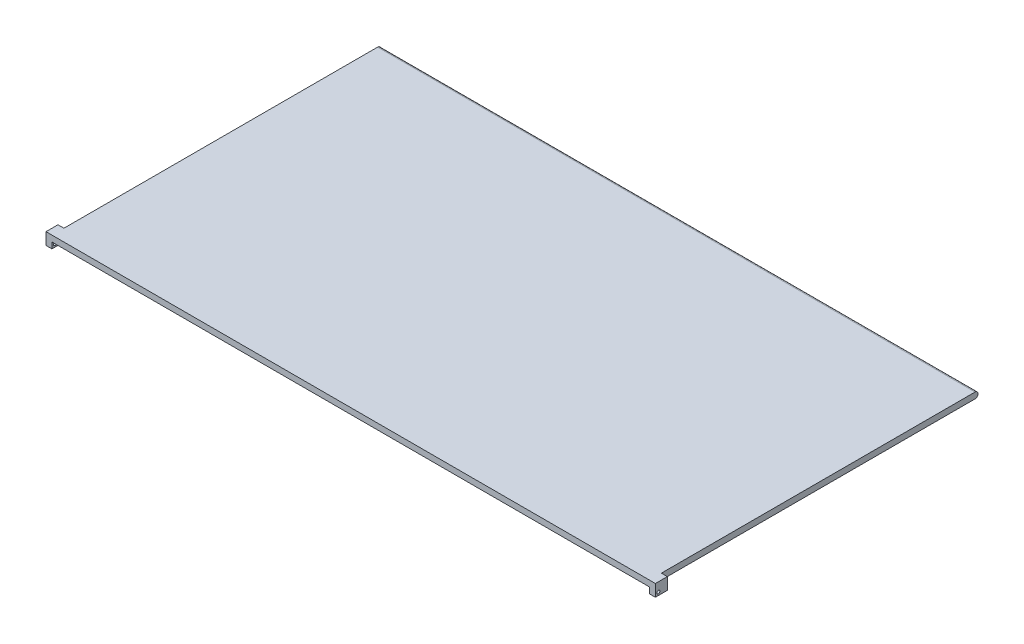
ISO-10303-21;
HEADER;
FILE_DESCRIPTION(('STEP AP214'),'2;1');
FILE_NAME('part.step','',(''),(''),'','','');
FILE_SCHEMA(('AUTOMOTIVE_DESIGN { 1 0 10303 214 1 1 1 1 }'));
ENDSEC;
DATA;
#1=APPLICATION_CONTEXT('core data for automotive mechanical design processes');
#2=APPLICATION_PROTOCOL_DEFINITION('international standard','automotive_design',2000,#1);
#3=PRODUCT_CONTEXT('',#1,'mechanical');
#4=PRODUCT('Part','Part','',(#3));
#5=PRODUCT_RELATED_PRODUCT_CATEGORY('part','',(#4));
#6=PRODUCT_DEFINITION_FORMATION('','',#4);
#7=PRODUCT_DEFINITION_CONTEXT('part definition',#1,'design');
#8=PRODUCT_DEFINITION('design','',#6,#7);
#9=PRODUCT_DEFINITION_SHAPE('','',#8);
#10=(LENGTH_UNIT() NAMED_UNIT(*) SI_UNIT(.MILLI.,.METRE.));
#11=(NAMED_UNIT(*) PLANE_ANGLE_UNIT() SI_UNIT($,.RADIAN.));
#12=(NAMED_UNIT(*) SI_UNIT($,.STERADIAN.) SOLID_ANGLE_UNIT());
#13=UNCERTAINTY_MEASURE_WITH_UNIT(LENGTH_MEASURE(1.E-05),#10,'distance_accuracy_value','');
#14=(GEOMETRIC_REPRESENTATION_CONTEXT(3) GLOBAL_UNCERTAINTY_ASSIGNED_CONTEXT((#13)) GLOBAL_UNIT_ASSIGNED_CONTEXT((#10,
#11,#12)) REPRESENTATION_CONTEXT('',''));
#15=CARTESIAN_POINT('',(0.,0.,0.));
#16=DIRECTION('',(0.,0.,1.));
#17=DIRECTION('',(1.,0.,0.));
#18=AXIS2_PLACEMENT_3D('',#15,#16,#17);
#19=CARTESIAN_POINT('',(100.,2.,55.));
#20=DIRECTION('',(-1.,0.,0.));
#21=DIRECTION('',(0.,0.,1.));
#22=AXIS2_PLACEMENT_3D('',#19,#20,#21);
#23=PLANE('',#22);
#24=DIRECTION('',(0.,1.,0.));
#25=VECTOR('',#24,1.);
#26=CARTESIAN_POINT('',(100.,-2.,51.));
#27=LINE('',#26,#25);
#28=CARTESIAN_POINT('',(100.,0.,51.));
#29=VERTEX_POINT('',#28);
#30=CARTESIAN_POINT('',(100.,1.99999999999998,51.));
#31=VERTEX_POINT('',#30);
#32=EDGE_CURVE('E11',#29,#31,#27,.T.);
#33=ORIENTED_EDGE('',*,*,#32,.F.);
#34=DIRECTION('',(0.,0.,-1.));
#35=VECTOR('',#34,1.);
#36=CARTESIAN_POINT('',(100.,0.,55.));
#37=LINE('',#36,#35);
#38=CARTESIAN_POINT('',(100.,0.,-54.));
#39=VERTEX_POINT('',#38);
#40=EDGE_CURVE('E224',#29,#39,#37,.T.);
#41=ORIENTED_EDGE('',*,*,#40,.T.);
#42=CARTESIAN_POINT('',(100.,1.,-54.));
#43=DIRECTION('',(-1.,0.,0.));
#44=DIRECTION('',(0.,0.,1.));
#45=AXIS2_PLACEMENT_3D('',#42,#43,#44);
#46=CIRCLE('',#45,1.);
#47=CARTESIAN_POINT('',(100.,1.,-55.));
#48=VERTEX_POINT('',#47);
#49=EDGE_CURVE('E237',#39,#48,#46,.F.);
#50=ORIENTED_EDGE('',*,*,#49,.T.);
#51=CARTESIAN_POINT('',(100.,1.,-54.));
#52=DIRECTION('',(-1.,0.,0.));
#53=DIRECTION('',(0.,0.,1.));
#54=AXIS2_PLACEMENT_3D('',#51,#52,#53);
#55=CIRCLE('',#54,1.);
#56=CARTESIAN_POINT('',(100.,2.,-54.));
#57=VERTEX_POINT('',#56);
#58=EDGE_CURVE('E234',#48,#57,#55,.F.);
#59=ORIENTED_EDGE('',*,*,#58,.T.);
#60=DIRECTION('',(0.,0.,-1.));
#61=VECTOR('',#60,1.);
#62=CARTESIAN_POINT('',(100.,2.,55.));
#63=LINE('',#62,#61);
#64=EDGE_CURVE('E162',#31,#57,#63,.T.);
#65=ORIENTED_EDGE('',*,*,#64,.F.);
#66=EDGE_LOOP('',(#33,#41,#50,#59,#65));
#67=FACE_BOUND('',#66,.T.);
#68=ADVANCED_FACE('F35',(#67),#23,.F.);
#69=CARTESIAN_POINT('',(-100.,2.,55.));
#70=DIRECTION('',(1.,0.,0.));
#71=DIRECTION('',(0.,0.,-1.));
#72=AXIS2_PLACEMENT_3D('',#69,#70,#71);
#73=PLANE('',#72);
#74=DIRECTION('',(0.,-1.,0.));
#75=VECTOR('',#74,1.);
#76=CARTESIAN_POINT('',(-100.,2.,51.));
#77=LINE('',#76,#75);
#78=CARTESIAN_POINT('',(-100.,2.,51.));
#79=VERTEX_POINT('',#78);
#80=CARTESIAN_POINT('',(-100.,0.,51.));
#81=VERTEX_POINT('',#80);
#82=EDGE_CURVE('E59',#79,#81,#77,.T.);
#83=ORIENTED_EDGE('',*,*,#82,.F.);
#84=DIRECTION('',(0.,0.,1.));
#85=VECTOR('',#84,1.);
#86=CARTESIAN_POINT('',(-100.,2.,55.));
#87=LINE('',#86,#85);
#88=CARTESIAN_POINT('',(-100.,2.,-54.));
#89=VERTEX_POINT('',#88);
#90=EDGE_CURVE('E205',#89,#79,#87,.T.);
#91=ORIENTED_EDGE('',*,*,#90,.F.);
#92=CARTESIAN_POINT('',(-100.,1.,-54.));
#93=DIRECTION('',(1.,0.,0.));
#94=DIRECTION('',(0.,0.,-1.));
#95=AXIS2_PLACEMENT_3D('',#92,#93,#94);
#96=CIRCLE('',#95,1.);
#97=CARTESIAN_POINT('',(-100.,1.,-55.));
#98=VERTEX_POINT('',#97);
#99=EDGE_CURVE('E227',#89,#98,#96,.F.);
#100=ORIENTED_EDGE('',*,*,#99,.T.);
#101=CARTESIAN_POINT('',(-100.,1.,-54.));
#102=DIRECTION('',(1.,0.,0.));
#103=DIRECTION('',(0.,0.,-1.));
#104=AXIS2_PLACEMENT_3D('',#101,#102,#103);
#105=CIRCLE('',#104,1.);
#106=CARTESIAN_POINT('',(-100.,0.,-54.));
#107=VERTEX_POINT('',#106);
#108=EDGE_CURVE('E229',#98,#107,#105,.F.);
#109=ORIENTED_EDGE('',*,*,#108,.T.);
#110=DIRECTION('',(0.,0.,1.));
#111=VECTOR('',#110,1.);
#112=CARTESIAN_POINT('',(-100.,0.,55.));
#113=LINE('',#112,#111);
#114=EDGE_CURVE('E220',#107,#81,#113,.T.);
#115=ORIENTED_EDGE('',*,*,#114,.T.);
#116=EDGE_LOOP('',(#83,#91,#100,#109,#115));
#117=FACE_BOUND('',#116,.T.);
#118=ADVANCED_FACE('F243',(#117),#73,.F.);
#119=CARTESIAN_POINT('',(100.,2.,55.));
#120=DIRECTION('',(0.,0.,-1.));
#121=DIRECTION('',(-1.,0.,0.));
#122=AXIS2_PLACEMENT_3D('',#119,#120,#121);
#123=PLANE('',#122);
#124=DIRECTION('',(1.,0.,0.));
#125=VECTOR('',#124,1.);
#126=CARTESIAN_POINT('',(100.,0.,55.));
#127=LINE('',#126,#125);
#128=CARTESIAN_POINT('',(-100.,0.,55.));
#129=VERTEX_POINT('',#128);
#130=CARTESIAN_POINT('',(100.,0.,55.));
#131=VERTEX_POINT('',#130);
#132=EDGE_CURVE('E221',#129,#131,#127,.T.);
#133=ORIENTED_EDGE('',*,*,#132,.T.);
#134=DIRECTION('',(0.,-1.,0.));
#135=VECTOR('',#134,1.);
#136=CARTESIAN_POINT('',(100.,-2.,55.));
#137=LINE('',#136,#135);
#138=CARTESIAN_POINT('',(100.,-2.,55.));
#139=VERTEX_POINT('',#138);
#140=EDGE_CURVE('E169',#131,#139,#137,.T.);
#141=ORIENTED_EDGE('',*,*,#140,.T.);
#142=DIRECTION('',(-1.,0.,0.));
#143=VECTOR('',#142,1.);
#144=CARTESIAN_POINT('',(102.,-2.,55.));
#145=LINE('',#144,#143);
#146=CARTESIAN_POINT('',(102.,-2.,55.));
#147=VERTEX_POINT('',#146);
#148=EDGE_CURVE('E151',#147,#139,#145,.T.);
#149=ORIENTED_EDGE('',*,*,#148,.F.);
#150=DIRECTION('',(0.,-1.,0.));
#151=VECTOR('',#150,1.);
#152=CARTESIAN_POINT('',(102.,-2.,55.));
#153=LINE('',#152,#151);
#154=CARTESIAN_POINT('',(102.,2.,55.));
#155=VERTEX_POINT('',#154);
#156=EDGE_CURVE('E135',#155,#147,#153,.T.);
#157=ORIENTED_EDGE('',*,*,#156,.F.);
#158=DIRECTION('',(1.,0.,0.));
#159=VECTOR('',#158,1.);
#160=CARTESIAN_POINT('',(100.,2.,55.));
#161=LINE('',#160,#159);
#162=CARTESIAN_POINT('',(-102.,2.,55.));
#163=VERTEX_POINT('',#162);
#164=EDGE_CURVE('E132',#163,#155,#161,.T.);
#165=ORIENTED_EDGE('',*,*,#164,.F.);
#166=DIRECTION('',(0.,1.,0.));
#167=VECTOR('',#166,1.);
#168=CARTESIAN_POINT('',(-102.,2.,55.));
#169=LINE('',#168,#167);
#170=CARTESIAN_POINT('',(-102.,-2.,55.));
#171=VERTEX_POINT('',#170);
#172=EDGE_CURVE('E180',#171,#163,#169,.T.);
#173=ORIENTED_EDGE('',*,*,#172,.F.);
#174=DIRECTION('',(1.,0.,0.));
#175=VECTOR('',#174,1.);
#176=CARTESIAN_POINT('',(-102.,-2.,55.));
#177=LINE('',#176,#175);
#178=CARTESIAN_POINT('',(-100.,-2.,55.));
#179=VERTEX_POINT('',#178);
#180=EDGE_CURVE('E190',#171,#179,#177,.T.);
#181=ORIENTED_EDGE('',*,*,#180,.T.);
#182=DIRECTION('',(0.,1.,0.));
#183=VECTOR('',#182,1.);
#184=CARTESIAN_POINT('',(-100.,2.,55.));
#185=LINE('',#184,#183);
#186=EDGE_CURVE('E178',#179,#129,#185,.T.);
#187=ORIENTED_EDGE('',*,*,#186,.T.);
#188=EDGE_LOOP('',(#133,#141,#149,#157,#165,#173,#181,#187));
#189=FACE_BOUND('',#188,.T.);
#190=ADVANCED_FACE('F275',(#189),#123,.F.);
#191=CARTESIAN_POINT('',(0.,2.,0.));
#192=DIRECTION('',(0.,1.,0.));
#193=DIRECTION('',(0.,0.,1.));
#194=AXIS2_PLACEMENT_3D('',#191,#192,#193);
#195=PLANE('',#194);
#196=ORIENTED_EDGE('',*,*,#164,.T.);
#197=DIRECTION('',(0.,0.,1.));
#198=VECTOR('',#197,1.);
#199=CARTESIAN_POINT('',(102.,1.99999999999998,51.));
#200=LINE('',#199,#198);
#201=CARTESIAN_POINT('',(102.,1.99999999999998,51.));
#202=VERTEX_POINT('',#201);
#203=EDGE_CURVE('E126',#202,#155,#200,.T.);
#204=ORIENTED_EDGE('',*,*,#203,.F.);
#205=DIRECTION('',(-1.,0.,0.));
#206=VECTOR('',#205,1.);
#207=CARTESIAN_POINT('',(102.,1.99999999999998,51.));
#208=LINE('',#207,#206);
#209=EDGE_CURVE('E130',#202,#31,#208,.T.);
#210=ORIENTED_EDGE('',*,*,#209,.T.);
#211=ORIENTED_EDGE('',*,*,#64,.T.);
#212=DIRECTION('',(-1.,0.,0.));
#213=VECTOR('',#212,1.);
#214=CARTESIAN_POINT('',(-100.,2.,-54.));
#215=LINE('',#214,#213);
#216=EDGE_CURVE('E45',#57,#89,#215,.T.);
#217=ORIENTED_EDGE('',*,*,#216,.T.);
#218=ORIENTED_EDGE('',*,*,#90,.T.);
#219=DIRECTION('',(1.,0.,0.));
#220=VECTOR('',#219,1.);
#221=CARTESIAN_POINT('',(-102.,2.,51.));
#222=LINE('',#221,#220);
#223=CARTESIAN_POINT('',(-102.,2.,51.));
#224=VERTEX_POINT('',#223);
#225=EDGE_CURVE('E211',#224,#79,#222,.T.);
#226=ORIENTED_EDGE('',*,*,#225,.F.);
#227=DIRECTION('',(0.,0.,-1.));
#228=VECTOR('',#227,1.);
#229=CARTESIAN_POINT('',(-102.,2.,55.));
#230=LINE('',#229,#228);
#231=EDGE_CURVE('E183',#163,#224,#230,.T.);
#232=ORIENTED_EDGE('',*,*,#231,.F.);
#233=EDGE_LOOP('',(#196,#204,#210,#211,#217,#218,#226,#232));
#234=FACE_BOUND('',#233,.T.);
#235=ADVANCED_FACE('F128',(#234),#195,.T.);
#236=CARTESIAN_POINT('',(0.,0.,0.));
#237=DIRECTION('',(0.,1.,0.));
#238=DIRECTION('',(0.,0.,1.));
#239=AXIS2_PLACEMENT_3D('',#236,#237,#238);
#240=PLANE('',#239);
#241=ORIENTED_EDGE('',*,*,#114,.F.);
#242=DIRECTION('',(-1.,0.,0.));
#243=VECTOR('',#242,1.);
#244=CARTESIAN_POINT('',(0.,0.,-54.));
#245=LINE('',#244,#243);
#246=EDGE_CURVE('E231',#107,#39,#245,.F.);
#247=ORIENTED_EDGE('',*,*,#246,.T.);
#248=ORIENTED_EDGE('',*,*,#40,.F.);
#249=EDGE_CURVE('E39',#131,#29,#37,.T.);
#250=ORIENTED_EDGE('',*,*,#249,.F.);
#251=ORIENTED_EDGE('',*,*,#132,.F.);
#252=EDGE_CURVE('E216',#81,#129,#113,.T.);
#253=ORIENTED_EDGE('',*,*,#252,.F.);
#254=EDGE_LOOP('',(#241,#247,#248,#250,#251,#253));
#255=FACE_BOUND('',#254,.T.);
#256=ADVANCED_FACE('F254',(#255),#240,.F.);
#257=CARTESIAN_POINT('',(0.,1.,-54.));
#258=DIRECTION('',(1.,0.,0.));
#259=DIRECTION('',(0.,0.,-1.));
#260=AXIS2_PLACEMENT_3D('',#257,#258,#259);
#261=CYLINDRICAL_SURFACE('',#260,1.);
#262=ORIENTED_EDGE('',*,*,#216,.F.);
#263=ORIENTED_EDGE('',*,*,#58,.F.);
#264=DIRECTION('',(-1.,0.,0.));
#265=VECTOR('',#264,1.);
#266=CARTESIAN_POINT('',(100.,1.,-55.));
#267=LINE('',#266,#265);
#268=EDGE_CURVE('E208',#98,#48,#267,.F.);
#269=ORIENTED_EDGE('',*,*,#268,.F.);
#270=ORIENTED_EDGE('',*,*,#99,.F.);
#271=EDGE_LOOP('',(#262,#263,#269,#270));
#272=FACE_BOUND('',#271,.T.);
#273=ADVANCED_FACE('F37',(#272),#261,.T.);
#274=CARTESIAN_POINT('',(100.,1.,-54.));
#275=DIRECTION('',(-1.,0.,0.));
#276=DIRECTION('',(0.,0.,1.));
#277=AXIS2_PLACEMENT_3D('',#274,#275,#276);
#278=CYLINDRICAL_SURFACE('',#277,1.);
#279=ORIENTED_EDGE('',*,*,#49,.F.);
#280=ORIENTED_EDGE('',*,*,#246,.F.);
#281=ORIENTED_EDGE('',*,*,#108,.F.);
#282=ORIENTED_EDGE('',*,*,#268,.T.);
#283=EDGE_LOOP('',(#279,#280,#281,#282));
#284=FACE_BOUND('',#283,.T.);
#285=ADVANCED_FACE('F250',(#284),#278,.T.);
#286=CARTESIAN_POINT('',(-102.,0.,0.));
#287=DIRECTION('',(1.,0.,0.));
#288=DIRECTION('',(0.,0.,-1.));
#289=AXIS2_PLACEMENT_3D('',#286,#287,#288);
#290=PLANE('',#289);
#291=ORIENTED_EDGE('',*,*,#172,.T.);
#292=ORIENTED_EDGE('',*,*,#231,.T.);
#293=DIRECTION('',(0.,-1.,0.));
#294=VECTOR('',#293,1.);
#295=CARTESIAN_POINT('',(-102.,2.,51.));
#296=LINE('',#295,#294);
#297=CARTESIAN_POINT('',(-102.,-2.,51.));
#298=VERTEX_POINT('',#297);
#299=EDGE_CURVE('E186',#224,#298,#296,.T.);
#300=ORIENTED_EDGE('',*,*,#299,.T.);
#301=DIRECTION('',(0.,0.,1.));
#302=VECTOR('',#301,1.);
#303=CARTESIAN_POINT('',(-102.,-2.,55.));
#304=LINE('',#303,#302);
#305=EDGE_CURVE('E188',#298,#171,#304,.T.);
#306=ORIENTED_EDGE('',*,*,#305,.T.);
#307=EDGE_LOOP('',(#291,#292,#300,#306));
#308=FACE_BOUND('',#307,.T.);
#309=CARTESIAN_POINT('',(-102.,-1.00350559813833,54.));
#310=DIRECTION('',(-1.,0.,0.));
#311=DIRECTION('',(0.,0.,1.));
#312=AXIS2_PLACEMENT_3D('',#309,#310,#311);
#313=CIRCLE('',#312,0.499999999999999);
#314=CARTESIAN_POINT('',(-102.,-1.00350559813833,54.5));
#315=VERTEX_POINT('',#314);
#316=EDGE_CURVE('E154',#315,#315,#313,.T.);
#317=ORIENTED_EDGE('',*,*,#316,.F.);
#318=EDGE_LOOP('',(#317));
#319=FACE_BOUND('',#318,.T.);
#320=ADVANCED_FACE('F269',(#308,#319),#290,.F.);
#321=CARTESIAN_POINT('',(-100.,0.,0.));
#322=DIRECTION('',(1.,0.,0.));
#323=DIRECTION('',(0.,0.,-1.));
#324=AXIS2_PLACEMENT_3D('',#321,#322,#323);
#325=PLANE('',#324);
#326=CARTESIAN_POINT('',(-100.,-2.,51.));
#327=VERTEX_POINT('',#326);
#328=EDGE_CURVE('E193',#81,#327,#77,.T.);
#329=ORIENTED_EDGE('',*,*,#328,.F.);
#330=ORIENTED_EDGE('',*,*,#252,.T.);
#331=ORIENTED_EDGE('',*,*,#186,.F.);
#332=DIRECTION('',(0.,0.,1.));
#333=VECTOR('',#332,1.);
#334=CARTESIAN_POINT('',(-100.,-2.,55.));
#335=LINE('',#334,#333);
#336=EDGE_CURVE('E184',#327,#179,#335,.T.);
#337=ORIENTED_EDGE('',*,*,#336,.F.);
#338=EDGE_LOOP('',(#329,#330,#331,#337));
#339=FACE_BOUND('',#338,.T.);
#340=CARTESIAN_POINT('',(-100.,-1.00350559813833,54.));
#341=DIRECTION('',(-1.,0.,0.));
#342=DIRECTION('',(0.,0.,1.));
#343=AXIS2_PLACEMENT_3D('',#340,#341,#342);
#344=CIRCLE('',#343,0.499999999999999);
#345=CARTESIAN_POINT('',(-100.,-1.00350559813833,54.5));
#346=VERTEX_POINT('',#345);
#347=EDGE_CURVE('E150',#346,#346,#344,.T.);
#348=ORIENTED_EDGE('',*,*,#347,.T.);
#349=EDGE_LOOP('',(#348));
#350=FACE_BOUND('',#349,.T.);
#351=ADVANCED_FACE('F260',(#339,#350),#325,.T.);
#352=CARTESIAN_POINT('',(-102.,2.,51.));
#353=DIRECTION('',(0.,0.,1.));
#354=DIRECTION('',(1.,0.,0.));
#355=AXIS2_PLACEMENT_3D('',#352,#353,#354);
#356=PLANE('',#355);
#357=ORIENTED_EDGE('',*,*,#82,.T.);
#358=ORIENTED_EDGE('',*,*,#328,.T.);
#359=DIRECTION('',(1.,0.,0.));
#360=VECTOR('',#359,1.);
#361=CARTESIAN_POINT('',(-102.,-2.,51.));
#362=LINE('',#361,#360);
#363=EDGE_CURVE('E200',#298,#327,#362,.T.);
#364=ORIENTED_EDGE('',*,*,#363,.F.);
#365=ORIENTED_EDGE('',*,*,#299,.F.);
#366=ORIENTED_EDGE('',*,*,#225,.T.);
#367=EDGE_LOOP('',(#357,#358,#364,#365,#366));
#368=FACE_BOUND('',#367,.T.);
#369=ADVANCED_FACE('F265',(#368),#356,.F.);
#370=CARTESIAN_POINT('',(-102.,-2.,55.));
#371=DIRECTION('',(0.,1.,0.));
#372=DIRECTION('',(0.,0.,1.));
#373=AXIS2_PLACEMENT_3D('',#370,#371,#372);
#374=PLANE('',#373);
#375=ORIENTED_EDGE('',*,*,#336,.T.);
#376=ORIENTED_EDGE('',*,*,#180,.F.);
#377=ORIENTED_EDGE('',*,*,#305,.F.);
#378=ORIENTED_EDGE('',*,*,#363,.T.);
#379=EDGE_LOOP('',(#375,#376,#377,#378));
#380=FACE_BOUND('',#379,.T.);
#381=ADVANCED_FACE('F326',(#380),#374,.F.);
#382=CARTESIAN_POINT('',(-102.,-1.00350559813833,54.));
#383=DIRECTION('',(1.,0.,0.));
#384=DIRECTION('',(0.,0.,-1.));
#385=AXIS2_PLACEMENT_3D('',#382,#383,#384);
#386=CYLINDRICAL_SURFACE('',#385,0.499999999999999);
#387=ORIENTED_EDGE('',*,*,#316,.T.);
#388=EDGE_LOOP('',(#387));
#389=FACE_BOUND('',#388,.T.);
#390=ORIENTED_EDGE('',*,*,#347,.F.);
#391=EDGE_LOOP('',(#390));
#392=FACE_BOUND('',#391,.T.);
#393=ADVANCED_FACE('F295',(#389,#392),#386,.F.);
#394=CARTESIAN_POINT('',(100.,0.,0.));
#395=DIRECTION('',(1.,0.,0.));
#396=DIRECTION('',(0.,0.,-1.));
#397=AXIS2_PLACEMENT_3D('',#394,#395,#396);
#398=PLANE('',#397);
#399=CARTESIAN_POINT('',(100.,-1.00350559813833,54.));
#400=DIRECTION('',(1.,0.,0.));
#401=DIRECTION('',(0.,0.,-1.));
#402=AXIS2_PLACEMENT_3D('',#399,#400,#401);
#403=CIRCLE('',#402,0.499999999999999);
#404=CARTESIAN_POINT('',(100.,-1.00350559813833,53.5));
#405=VERTEX_POINT('',#404);
#406=EDGE_CURVE('E278',#405,#405,#403,.T.);
#407=ORIENTED_EDGE('',*,*,#406,.T.);
#408=EDGE_LOOP('',(#407));
#409=FACE_BOUND('',#408,.T.);
#410=ORIENTED_EDGE('',*,*,#140,.F.);
#411=ORIENTED_EDGE('',*,*,#249,.T.);
#412=CARTESIAN_POINT('',(100.,-2.,51.));
#413=VERTEX_POINT('',#412);
#414=EDGE_CURVE('E165',#413,#29,#27,.T.);
#415=ORIENTED_EDGE('',*,*,#414,.F.);
#416=DIRECTION('',(0.,0.,-1.));
#417=VECTOR('',#416,1.);
#418=CARTESIAN_POINT('',(100.,-2.,51.));
#419=LINE('',#418,#417);
#420=EDGE_CURVE('E146',#139,#413,#419,.T.);
#421=ORIENTED_EDGE('',*,*,#420,.F.);
#422=EDGE_LOOP('',(#410,#411,#415,#421));
#423=FACE_BOUND('',#422,.T.);
#424=ADVANCED_FACE('F287',(#409,#423),#398,.F.);
#425=CARTESIAN_POINT('',(102.,0.,0.));
#426=DIRECTION('',(1.,0.,0.));
#427=DIRECTION('',(0.,0.,-1.));
#428=AXIS2_PLACEMENT_3D('',#425,#426,#427);
#429=PLANE('',#428);
#430=DIRECTION('',(0.,1.,0.));
#431=VECTOR('',#430,1.);
#432=CARTESIAN_POINT('',(102.,-2.,51.));
#433=LINE('',#432,#431);
#434=CARTESIAN_POINT('',(102.,-2.,51.));
#435=VERTEX_POINT('',#434);
#436=EDGE_CURVE('E136',#435,#202,#433,.T.);
#437=ORIENTED_EDGE('',*,*,#436,.T.);
#438=ORIENTED_EDGE('',*,*,#203,.T.);
#439=ORIENTED_EDGE('',*,*,#156,.T.);
#440=DIRECTION('',(0.,0.,-1.));
#441=VECTOR('',#440,1.);
#442=CARTESIAN_POINT('',(102.,-2.,51.));
#443=LINE('',#442,#441);
#444=EDGE_CURVE('E142',#147,#435,#443,.T.);
#445=ORIENTED_EDGE('',*,*,#444,.T.);
#446=EDGE_LOOP('',(#437,#438,#439,#445));
#447=FACE_BOUND('',#446,.T.);
#448=CARTESIAN_POINT('',(102.,-1.00350559813833,54.));
#449=DIRECTION('',(1.,0.,0.));
#450=DIRECTION('',(0.,0.,-1.));
#451=AXIS2_PLACEMENT_3D('',#448,#449,#450);
#452=CIRCLE('',#451,0.499999999999999);
#453=CARTESIAN_POINT('',(102.,-1.00350559813833,53.5));
#454=VERTEX_POINT('',#453);
#455=EDGE_CURVE('E170',#454,#454,#452,.T.);
#456=ORIENTED_EDGE('',*,*,#455,.F.);
#457=EDGE_LOOP('',(#456));
#458=FACE_BOUND('',#457,.T.);
#459=ADVANCED_FACE('F139',(#447,#458),#429,.T.);
#460=CARTESIAN_POINT('',(102.,-2.,51.));
#461=DIRECTION('',(0.,0.,1.));
#462=DIRECTION('',(1.,0.,0.));
#463=AXIS2_PLACEMENT_3D('',#460,#461,#462);
#464=PLANE('',#463);
#465=ORIENTED_EDGE('',*,*,#414,.T.);
#466=ORIENTED_EDGE('',*,*,#32,.T.);
#467=ORIENTED_EDGE('',*,*,#209,.F.);
#468=ORIENTED_EDGE('',*,*,#436,.F.);
#469=DIRECTION('',(-1.,0.,0.));
#470=VECTOR('',#469,1.);
#471=CARTESIAN_POINT('',(102.,-2.,51.));
#472=LINE('',#471,#470);
#473=EDGE_CURVE('E157',#435,#413,#472,.T.);
#474=ORIENTED_EDGE('',*,*,#473,.T.);
#475=EDGE_LOOP('',(#465,#466,#467,#468,#474));
#476=FACE_BOUND('',#475,.T.);
#477=ADVANCED_FACE('F149',(#476),#464,.F.);
#478=CARTESIAN_POINT('',(102.,-2.,51.));
#479=DIRECTION('',(0.,1.,0.));
#480=DIRECTION('',(0.,0.,1.));
#481=AXIS2_PLACEMENT_3D('',#478,#479,#480);
#482=PLANE('',#481);
#483=ORIENTED_EDGE('',*,*,#420,.T.);
#484=ORIENTED_EDGE('',*,*,#473,.F.);
#485=ORIENTED_EDGE('',*,*,#444,.F.);
#486=ORIENTED_EDGE('',*,*,#148,.T.);
#487=EDGE_LOOP('',(#483,#484,#485,#486));
#488=FACE_BOUND('',#487,.T.);
#489=ADVANCED_FACE('F293',(#488),#482,.F.);
#490=CARTESIAN_POINT('',(102.,-1.00350559813833,54.));
#491=DIRECTION('',(-1.,0.,0.));
#492=DIRECTION('',(0.,0.,1.));
#493=AXIS2_PLACEMENT_3D('',#490,#491,#492);
#494=CYLINDRICAL_SURFACE('',#493,0.499999999999999);
#495=ORIENTED_EDGE('',*,*,#455,.T.);
#496=EDGE_LOOP('',(#495));
#497=FACE_BOUND('',#496,.T.);
#498=ORIENTED_EDGE('',*,*,#406,.F.);
#499=EDGE_LOOP('',(#498));
#500=FACE_BOUND('',#499,.T.);
#501=ADVANCED_FACE('F284',(#497,#500),#494,.F.);
#502=CLOSED_SHELL('',(#68,#118,#190,#235,#256,#273,#285,#320,#351,#369,#381,#393,#424,#459,#477,
#489,#501));
#503=MANIFOLD_SOLID_BREP('B2',#502);
#504=ADVANCED_BREP_SHAPE_REPRESENTATION('',(#18,#503),#14);
#505=SHAPE_DEFINITION_REPRESENTATION(#9,#504);
ENDSEC;
END-ISO-10303-21;
